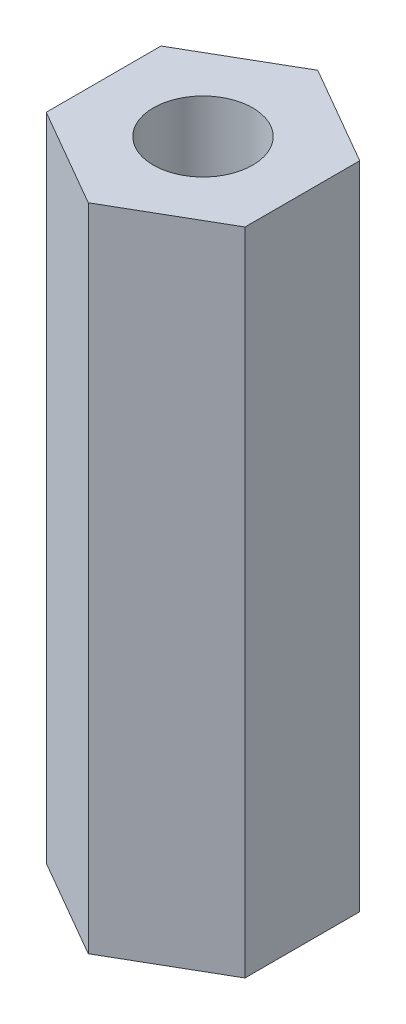
ISO-10303-21;
HEADER;
FILE_DESCRIPTION(('STEP AP214'),'2;1');
FILE_NAME('part.step','',(''),(''),'','','');
FILE_SCHEMA(('AUTOMOTIVE_DESIGN { 1 0 10303 214 1 1 1 1 }'));
ENDSEC;
DATA;
#1=APPLICATION_CONTEXT('core data for automotive mechanical design processes');
#2=APPLICATION_PROTOCOL_DEFINITION('international standard','automotive_design',2000,#1);
#3=PRODUCT_CONTEXT('',#1,'mechanical');
#4=PRODUCT('Part','Part','',(#3));
#5=PRODUCT_RELATED_PRODUCT_CATEGORY('part','',(#4));
#6=PRODUCT_DEFINITION_FORMATION('','',#4);
#7=PRODUCT_DEFINITION_CONTEXT('part definition',#1,'design');
#8=PRODUCT_DEFINITION('design','',#6,#7);
#9=PRODUCT_DEFINITION_SHAPE('','',#8);
#10=(LENGTH_UNIT() NAMED_UNIT(*) SI_UNIT(.MILLI.,.METRE.));
#11=(NAMED_UNIT(*) PLANE_ANGLE_UNIT() SI_UNIT($,.RADIAN.));
#12=(NAMED_UNIT(*) SI_UNIT($,.STERADIAN.) SOLID_ANGLE_UNIT());
#13=UNCERTAINTY_MEASURE_WITH_UNIT(LENGTH_MEASURE(1.E-05),#10,'distance_accuracy_value','');
#14=(GEOMETRIC_REPRESENTATION_CONTEXT(3) GLOBAL_UNCERTAINTY_ASSIGNED_CONTEXT((#13)) GLOBAL_UNIT_ASSIGNED_CONTEXT((#10,
#11,#12)) REPRESENTATION_CONTEXT('',''));
#15=CARTESIAN_POINT('',(0.,0.,0.));
#16=DIRECTION('',(0.,0.,1.));
#17=DIRECTION('',(1.,0.,0.));
#18=AXIS2_PLACEMENT_3D('',#15,#16,#17);
#19=CARTESIAN_POINT('',(0.,18.,0.));
#20=DIRECTION('',(0.,1.,0.));
#21=DIRECTION('',(0.,0.,1.));
#22=AXIS2_PLACEMENT_3D('',#19,#20,#21);
#23=PLANE('',#22);
#24=DIRECTION('',(-0.866025403784439,0.,0.5));
#25=VECTOR('',#24,1.);
#26=CARTESIAN_POINT('',(0.,18.,-3.17542648054294));
#27=LINE('',#26,#25);
#28=CARTESIAN_POINT('',(0.,18.,-3.17542648054294));
#29=VERTEX_POINT('',#28);
#30=CARTESIAN_POINT('',(-2.75,18.,-1.58771324027147));
#31=VERTEX_POINT('',#30);
#32=EDGE_CURVE('E146',#29,#31,#27,.T.);
#33=ORIENTED_EDGE('',*,*,#32,.T.);
#34=DIRECTION('',(0.,0.,1.));
#35=VECTOR('',#34,1.);
#36=CARTESIAN_POINT('',(-2.75,18.,-1.58771324027147));
#37=LINE('',#36,#35);
#38=CARTESIAN_POINT('',(-2.75,18.,1.58771324027147));
#39=VERTEX_POINT('',#38);
#40=EDGE_CURVE('E94',#31,#39,#37,.T.);
#41=ORIENTED_EDGE('',*,*,#40,.T.);
#42=DIRECTION('',(0.866025403784438,0.,0.5));
#43=VECTOR('',#42,1.);
#44=CARTESIAN_POINT('',(-2.75,18.,1.58771324027147));
#45=LINE('',#44,#43);
#46=CARTESIAN_POINT('',(0.,18.,3.17542648054294));
#47=VERTEX_POINT('',#46);
#48=EDGE_CURVE('E107',#39,#47,#45,.T.);
#49=ORIENTED_EDGE('',*,*,#48,.T.);
#50=DIRECTION('',(0.866025403784439,0.,-0.5));
#51=VECTOR('',#50,1.);
#52=CARTESIAN_POINT('',(0.,18.,3.17542648054294));
#53=LINE('',#52,#51);
#54=CARTESIAN_POINT('',(2.75,18.,1.58771324027147));
#55=VERTEX_POINT('',#54);
#56=EDGE_CURVE('E101',#47,#55,#53,.T.);
#57=ORIENTED_EDGE('',*,*,#56,.T.);
#58=DIRECTION('',(0.,0.,-1.));
#59=VECTOR('',#58,1.);
#60=CARTESIAN_POINT('',(2.75,18.,1.58771324027147));
#61=LINE('',#60,#59);
#62=CARTESIAN_POINT('',(2.75,18.,-1.58771324027147));
#63=VERTEX_POINT('',#62);
#64=EDGE_CURVE('E105',#55,#63,#61,.T.);
#65=ORIENTED_EDGE('',*,*,#64,.T.);
#66=DIRECTION('',(-0.866025403784439,0.,-0.5));
#67=VECTOR('',#66,1.);
#68=CARTESIAN_POINT('',(2.75,18.,-1.58771324027147));
#69=LINE('',#68,#67);
#70=EDGE_CURVE('E57',#63,#29,#69,.T.);
#71=ORIENTED_EDGE('',*,*,#70,.T.);
#72=EDGE_LOOP('',(#33,#41,#49,#57,#65,#71));
#73=FACE_BOUND('',#72,.T.);
#74=CARTESIAN_POINT('',(0.,18.,0.));
#75=DIRECTION('',(0.,1.,0.));
#76=DIRECTION('',(0.,0.,1.));
#77=AXIS2_PLACEMENT_3D('',#74,#75,#76);
#78=CIRCLE('',#77,1.375);
#79=CARTESIAN_POINT('',(0.,18.,1.375));
#80=VERTEX_POINT('',#79);
#81=EDGE_CURVE('E134',#80,#80,#78,.T.);
#82=ORIENTED_EDGE('',*,*,#81,.F.);
#83=EDGE_LOOP('',(#82));
#84=FACE_BOUND('',#83,.T.);
#85=ADVANCED_FACE('F39',(#73,#84),#23,.T.);
#86=CARTESIAN_POINT('',(0.,0.,0.));
#87=DIRECTION('',(0.,1.,0.));
#88=DIRECTION('',(0.,0.,1.));
#89=AXIS2_PLACEMENT_3D('',#86,#87,#88);
#90=PLANE('',#89);
#91=DIRECTION('',(-0.866025403784439,0.,0.5));
#92=VECTOR('',#91,1.);
#93=CARTESIAN_POINT('',(0.,0.,-3.17542648054294));
#94=LINE('',#93,#92);
#95=CARTESIAN_POINT('',(0.,0.,-3.17542648054294));
#96=VERTEX_POINT('',#95);
#97=CARTESIAN_POINT('',(-2.75,0.,-1.58771324027147));
#98=VERTEX_POINT('',#97);
#99=EDGE_CURVE('E129',#96,#98,#94,.T.);
#100=ORIENTED_EDGE('',*,*,#99,.F.);
#101=DIRECTION('',(-0.866025403784439,0.,-0.5));
#102=VECTOR('',#101,1.);
#103=CARTESIAN_POINT('',(2.75,0.,-1.58771324027147));
#104=LINE('',#103,#102);
#105=CARTESIAN_POINT('',(2.75,0.,-1.58771324027147));
#106=VERTEX_POINT('',#105);
#107=EDGE_CURVE('E86',#106,#96,#104,.T.);
#108=ORIENTED_EDGE('',*,*,#107,.F.);
#109=DIRECTION('',(0.,0.,-1.));
#110=VECTOR('',#109,1.);
#111=CARTESIAN_POINT('',(2.75,0.,1.58771324027147));
#112=LINE('',#111,#110);
#113=CARTESIAN_POINT('',(2.75,0.,1.58771324027147));
#114=VERTEX_POINT('',#113);
#115=EDGE_CURVE('E80',#114,#106,#112,.T.);
#116=ORIENTED_EDGE('',*,*,#115,.F.);
#117=DIRECTION('',(0.866025403784439,0.,-0.5));
#118=VECTOR('',#117,1.);
#119=CARTESIAN_POINT('',(0.,0.,3.17542648054294));
#120=LINE('',#119,#118);
#121=CARTESIAN_POINT('',(0.,0.,3.17542648054294));
#122=VERTEX_POINT('',#121);
#123=EDGE_CURVE('E116',#122,#114,#120,.T.);
#124=ORIENTED_EDGE('',*,*,#123,.F.);
#125=DIRECTION('',(0.866025403784438,0.,0.5));
#126=VECTOR('',#125,1.);
#127=CARTESIAN_POINT('',(-2.75,0.,1.58771324027147));
#128=LINE('',#127,#126);
#129=CARTESIAN_POINT('',(-2.75,0.,1.58771324027147));
#130=VERTEX_POINT('',#129);
#131=EDGE_CURVE('E137',#130,#122,#128,.T.);
#132=ORIENTED_EDGE('',*,*,#131,.F.);
#133=DIRECTION('',(0.,0.,1.));
#134=VECTOR('',#133,1.);
#135=CARTESIAN_POINT('',(-2.75,0.,-1.58771324027147));
#136=LINE('',#135,#134);
#137=EDGE_CURVE('E133',#98,#130,#136,.T.);
#138=ORIENTED_EDGE('',*,*,#137,.F.);
#139=EDGE_LOOP('',(#100,#108,#116,#124,#132,#138));
#140=FACE_BOUND('',#139,.T.);
#141=CARTESIAN_POINT('',(0.,0.,0.));
#142=DIRECTION('',(0.,1.,0.));
#143=DIRECTION('',(0.,0.,1.));
#144=AXIS2_PLACEMENT_3D('',#141,#142,#143);
#145=CIRCLE('',#144,1.375);
#146=CARTESIAN_POINT('',(0.,0.,1.375));
#147=VERTEX_POINT('',#146);
#148=EDGE_CURVE('E243',#147,#147,#145,.T.);
#149=ORIENTED_EDGE('',*,*,#148,.T.);
#150=EDGE_LOOP('',(#149));
#151=FACE_BOUND('',#150,.T.);
#152=ADVANCED_FACE('F159',(#140,#151),#90,.F.);
#153=CARTESIAN_POINT('',(0.,18.,-3.17542648054294));
#154=DIRECTION('',(0.5,0.,0.866025403784439));
#155=DIRECTION('',(0.866025403784439,0.,-0.5));
#156=AXIS2_PLACEMENT_3D('',#153,#154,#155);
#157=PLANE('',#156);
#158=ORIENTED_EDGE('',*,*,#99,.T.);
#159=DIRECTION('',(0.,-1.,0.));
#160=VECTOR('',#159,1.);
#161=CARTESIAN_POINT('',(-2.75,18.,-1.58771324027147));
#162=LINE('',#161,#160);
#163=EDGE_CURVE('E11',#31,#98,#162,.T.);
#164=ORIENTED_EDGE('',*,*,#163,.F.);
#165=ORIENTED_EDGE('',*,*,#32,.F.);
#166=DIRECTION('',(0.,-1.,0.));
#167=VECTOR('',#166,1.);
#168=CARTESIAN_POINT('',(0.,18.,-3.17542648054294));
#169=LINE('',#168,#167);
#170=EDGE_CURVE('E125',#29,#96,#169,.T.);
#171=ORIENTED_EDGE('',*,*,#170,.T.);
#172=EDGE_LOOP('',(#158,#164,#165,#171));
#173=FACE_BOUND('',#172,.T.);
#174=ADVANCED_FACE('F41',(#173),#157,.F.);
#175=CARTESIAN_POINT('',(-2.75,18.,-1.58771324027147));
#176=DIRECTION('',(1.,0.,0.));
#177=DIRECTION('',(0.,0.,-1.));
#178=AXIS2_PLACEMENT_3D('',#175,#176,#177);
#179=PLANE('',#178);
#180=ORIENTED_EDGE('',*,*,#137,.T.);
#181=DIRECTION('',(0.,-1.,0.));
#182=VECTOR('',#181,1.);
#183=CARTESIAN_POINT('',(-2.75,18.,1.58771324027147));
#184=LINE('',#183,#182);
#185=EDGE_CURVE('E49',#39,#130,#184,.T.);
#186=ORIENTED_EDGE('',*,*,#185,.F.);
#187=ORIENTED_EDGE('',*,*,#40,.F.);
#188=ORIENTED_EDGE('',*,*,#163,.T.);
#189=EDGE_LOOP('',(#180,#186,#187,#188));
#190=FACE_BOUND('',#189,.T.);
#191=ADVANCED_FACE('F184',(#190),#179,.F.);
#192=CARTESIAN_POINT('',(-2.75,18.,1.58771324027147));
#193=DIRECTION('',(0.5,0.,-0.866025403784438));
#194=DIRECTION('',(-0.866025403784439,0.,-0.5));
#195=AXIS2_PLACEMENT_3D('',#192,#193,#194);
#196=PLANE('',#195);
#197=ORIENTED_EDGE('',*,*,#131,.T.);
#198=DIRECTION('',(0.,-1.,0.));
#199=VECTOR('',#198,1.);
#200=CARTESIAN_POINT('',(0.,18.,3.17542648054294));
#201=LINE('',#200,#199);
#202=EDGE_CURVE('E118',#47,#122,#201,.T.);
#203=ORIENTED_EDGE('',*,*,#202,.F.);
#204=ORIENTED_EDGE('',*,*,#48,.F.);
#205=ORIENTED_EDGE('',*,*,#185,.T.);
#206=EDGE_LOOP('',(#197,#203,#204,#205));
#207=FACE_BOUND('',#206,.T.);
#208=ADVANCED_FACE('F156',(#207),#196,.F.);
#209=CARTESIAN_POINT('',(0.,18.,3.17542648054294));
#210=DIRECTION('',(-0.5,0.,-0.866025403784439));
#211=DIRECTION('',(-0.866025403784439,0.,0.5));
#212=AXIS2_PLACEMENT_3D('',#209,#210,#211);
#213=PLANE('',#212);
#214=ORIENTED_EDGE('',*,*,#123,.T.);
#215=DIRECTION('',(0.,-1.,0.));
#216=VECTOR('',#215,1.);
#217=CARTESIAN_POINT('',(2.75,18.,1.58771324027147));
#218=LINE('',#217,#216);
#219=EDGE_CURVE('E113',#55,#114,#218,.T.);
#220=ORIENTED_EDGE('',*,*,#219,.F.);
#221=ORIENTED_EDGE('',*,*,#56,.F.);
#222=ORIENTED_EDGE('',*,*,#202,.T.);
#223=EDGE_LOOP('',(#214,#220,#221,#222));
#224=FACE_BOUND('',#223,.T.);
#225=ADVANCED_FACE('F114',(#224),#213,.F.);
#226=CARTESIAN_POINT('',(2.75,18.,1.58771324027147));
#227=DIRECTION('',(-1.,0.,0.));
#228=DIRECTION('',(0.,0.,1.));
#229=AXIS2_PLACEMENT_3D('',#226,#227,#228);
#230=PLANE('',#229);
#231=ORIENTED_EDGE('',*,*,#115,.T.);
#232=DIRECTION('',(0.,-1.,0.));
#233=VECTOR('',#232,1.);
#234=CARTESIAN_POINT('',(2.75,18.,-1.58771324027147));
#235=LINE('',#234,#233);
#236=EDGE_CURVE('E119',#63,#106,#235,.T.);
#237=ORIENTED_EDGE('',*,*,#236,.F.);
#238=ORIENTED_EDGE('',*,*,#64,.F.);
#239=ORIENTED_EDGE('',*,*,#219,.T.);
#240=EDGE_LOOP('',(#231,#237,#238,#239));
#241=FACE_BOUND('',#240,.T.);
#242=ADVANCED_FACE('F121',(#241),#230,.F.);
#243=CARTESIAN_POINT('',(2.75,18.,-1.58771324027147));
#244=DIRECTION('',(-0.5,0.,0.866025403784438));
#245=DIRECTION('',(0.866025403784439,0.,0.5));
#246=AXIS2_PLACEMENT_3D('',#243,#244,#245);
#247=PLANE('',#246);
#248=ORIENTED_EDGE('',*,*,#107,.T.);
#249=ORIENTED_EDGE('',*,*,#170,.F.);
#250=ORIENTED_EDGE('',*,*,#70,.F.);
#251=ORIENTED_EDGE('',*,*,#236,.T.);
#252=EDGE_LOOP('',(#248,#249,#250,#251));
#253=FACE_BOUND('',#252,.T.);
#254=ADVANCED_FACE('F164',(#253),#247,.F.);
#255=CARTESIAN_POINT('',(0.,18.,0.));
#256=DIRECTION('',(0.,-1.,0.));
#257=DIRECTION('',(0.,0.,-1.));
#258=AXIS2_PLACEMENT_3D('',#255,#256,#257);
#259=CYLINDRICAL_SURFACE('',#258,1.375);
#260=ORIENTED_EDGE('',*,*,#81,.T.);
#261=EDGE_LOOP('',(#260));
#262=FACE_BOUND('',#261,.T.);
#263=ORIENTED_EDGE('',*,*,#148,.F.);
#264=EDGE_LOOP('',(#263));
#265=FACE_BOUND('',#264,.T.);
#266=ADVANCED_FACE('F166',(#262,#265),#259,.F.);
#267=CLOSED_SHELL('',(#85,#152,#174,#191,#208,#225,#242,#254,#266));
#268=MANIFOLD_SOLID_BREP('B2',#267);
#269=ADVANCED_BREP_SHAPE_REPRESENTATION('',(#18,#268),#14);
#270=SHAPE_DEFINITION_REPRESENTATION(#9,#269);
ENDSEC;
END-ISO-10303-21;
